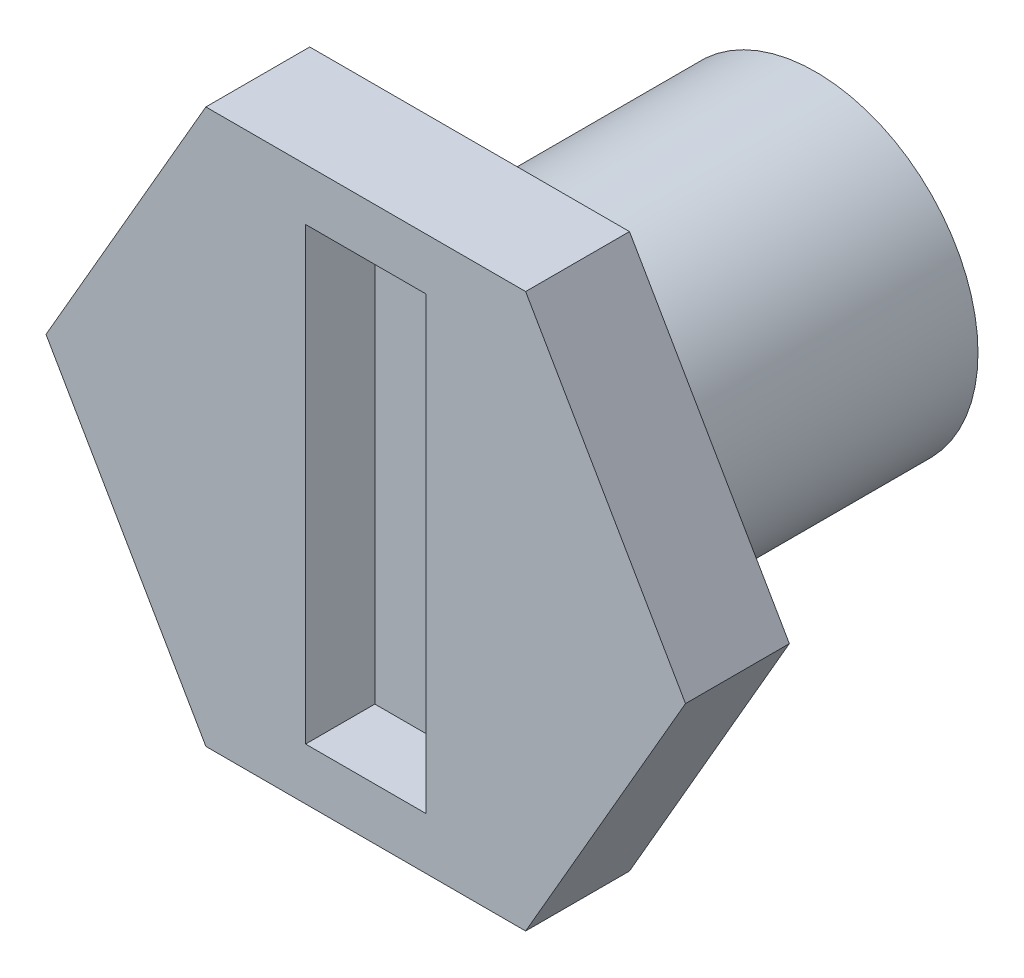
ISO-10303-21;
HEADER;
FILE_DESCRIPTION(('STEP AP214'),'2;1');
FILE_NAME('part.step','',(''),(''),'','','');
FILE_SCHEMA(('AUTOMOTIVE_DESIGN { 1 0 10303 214 1 1 1 1 }'));
ENDSEC;
DATA;
#1=APPLICATION_CONTEXT('core data for automotive mechanical design processes');
#2=APPLICATION_PROTOCOL_DEFINITION('international standard','automotive_design',2000,#1);
#3=PRODUCT_CONTEXT('',#1,'mechanical');
#4=PRODUCT('Part','Part','',(#3));
#5=PRODUCT_RELATED_PRODUCT_CATEGORY('part','',(#4));
#6=PRODUCT_DEFINITION_FORMATION('','',#4);
#7=PRODUCT_DEFINITION_CONTEXT('part definition',#1,'design');
#8=PRODUCT_DEFINITION('design','',#6,#7);
#9=PRODUCT_DEFINITION_SHAPE('','',#8);
#10=(LENGTH_UNIT() NAMED_UNIT(*) SI_UNIT(.MILLI.,.METRE.));
#11=(NAMED_UNIT(*) PLANE_ANGLE_UNIT() SI_UNIT($,.RADIAN.));
#12=(NAMED_UNIT(*) SI_UNIT($,.STERADIAN.) SOLID_ANGLE_UNIT());
#13=UNCERTAINTY_MEASURE_WITH_UNIT(LENGTH_MEASURE(1.E-05),#10,'distance_accuracy_value','');
#14=(GEOMETRIC_REPRESENTATION_CONTEXT(3) GLOBAL_UNCERTAINTY_ASSIGNED_CONTEXT((#13)) GLOBAL_UNIT_ASSIGNED_CONTEXT((#10,
#11,#12)) REPRESENTATION_CONTEXT('',''));
#15=CARTESIAN_POINT('',(0.,0.,0.));
#16=DIRECTION('',(0.,0.,1.));
#17=DIRECTION('',(1.,0.,0.));
#18=AXIS2_PLACEMENT_3D('',#15,#16,#17);
#19=CARTESIAN_POINT('',(0.,0.,100.));
#20=DIRECTION('',(0.,0.,-1.));
#21=DIRECTION('',(-1.,0.,0.));
#22=AXIS2_PLACEMENT_3D('',#19,#20,#21);
#23=CYLINDRICAL_SURFACE('',#22,46.875);
#24=CARTESIAN_POINT('',(0.,0.,100.));
#25=DIRECTION('',(0.,0.,1.));
#26=DIRECTION('',(1.,0.,0.));
#27=AXIS2_PLACEMENT_3D('',#24,#25,#26);
#28=CIRCLE('',#27,46.875);
#29=CARTESIAN_POINT('',(46.875,0.,100.));
#30=VERTEX_POINT('',#29);
#31=EDGE_CURVE('E11',#30,#30,#28,.T.);
#32=ORIENTED_EDGE('',*,*,#31,.F.);
#33=EDGE_LOOP('',(#32));
#34=FACE_BOUND('',#33,.T.);
#35=CARTESIAN_POINT('',(0.,0.,0.));
#36=DIRECTION('',(0.,0.,1.));
#37=DIRECTION('',(1.,0.,0.));
#38=AXIS2_PLACEMENT_3D('',#35,#36,#37);
#39=CIRCLE('',#38,46.875);
#40=CARTESIAN_POINT('',(46.875,0.,0.));
#41=VERTEX_POINT('',#40);
#42=EDGE_CURVE('E38',#41,#41,#39,.T.);
#43=ORIENTED_EDGE('',*,*,#42,.T.);
#44=EDGE_LOOP('',(#43));
#45=FACE_BOUND('',#44,.T.);
#46=ADVANCED_FACE('F35',(#34,#45),#23,.T.);
#47=CARTESIAN_POINT('',(0.,0.,0.));
#48=DIRECTION('',(0.,0.,1.));
#49=DIRECTION('',(1.,0.,0.));
#50=AXIS2_PLACEMENT_3D('',#47,#48,#49);
#51=PLANE('',#50);
#52=ORIENTED_EDGE('',*,*,#42,.F.);
#53=EDGE_LOOP('',(#52));
#54=FACE_BOUND('',#53,.T.);
#55=ADVANCED_FACE('F157',(#54),#51,.F.);
#56=CARTESIAN_POINT('',(0.,0.,100.));
#57=DIRECTION('',(0.,0.,1.));
#58=DIRECTION('',(1.,0.,0.));
#59=AXIS2_PLACEMENT_3D('',#56,#57,#58);
#60=PLANE('',#59);
#61=DIRECTION('',(0.5,0.866025403784439,0.));
#62=VECTOR('',#61,1.);
#63=CARTESIAN_POINT('',(46.1880215351701,-80.,100.));
#64=LINE('',#63,#62);
#65=CARTESIAN_POINT('',(46.1880215351701,-80.,100.));
#66=VERTEX_POINT('',#65);
#67=CARTESIAN_POINT('',(92.3760430703401,0.,100.));
#68=VERTEX_POINT('',#67);
#69=EDGE_CURVE('E132',#66,#68,#64,.T.);
#70=ORIENTED_EDGE('',*,*,#69,.F.);
#71=DIRECTION('',(1.,0.,0.));
#72=VECTOR('',#71,1.);
#73=CARTESIAN_POINT('',(-46.18802153517,-80.,100.));
#74=LINE('',#73,#72);
#75=CARTESIAN_POINT('',(-46.18802153517,-80.,100.));
#76=VERTEX_POINT('',#75);
#77=EDGE_CURVE('E85',#76,#66,#74,.T.);
#78=ORIENTED_EDGE('',*,*,#77,.F.);
#79=DIRECTION('',(0.5,-0.866025403784438,0.));
#80=VECTOR('',#79,1.);
#81=CARTESIAN_POINT('',(-92.3760430703401,0.,100.));
#82=LINE('',#81,#80);
#83=CARTESIAN_POINT('',(-92.3760430703401,0.,100.));
#84=VERTEX_POINT('',#83);
#85=EDGE_CURVE('E141',#84,#76,#82,.T.);
#86=ORIENTED_EDGE('',*,*,#85,.F.);
#87=DIRECTION('',(-0.5,-0.866025403784439,0.));
#88=VECTOR('',#87,1.);
#89=CARTESIAN_POINT('',(-46.1880215351701,80.,100.));
#90=LINE('',#89,#88);
#91=CARTESIAN_POINT('',(-46.1880215351701,80.,100.));
#92=VERTEX_POINT('',#91);
#93=EDGE_CURVE('E120',#92,#84,#90,.T.);
#94=ORIENTED_EDGE('',*,*,#93,.F.);
#95=DIRECTION('',(-1.,0.,0.));
#96=VECTOR('',#95,1.);
#97=CARTESIAN_POINT('',(46.18802153517,80.,100.));
#98=LINE('',#97,#96);
#99=CARTESIAN_POINT('',(46.18802153517,80.,100.));
#100=VERTEX_POINT('',#99);
#101=EDGE_CURVE('E138',#100,#92,#98,.T.);
#102=ORIENTED_EDGE('',*,*,#101,.F.);
#103=DIRECTION('',(-0.5,0.866025403784438,0.));
#104=VECTOR('',#103,1.);
#105=CARTESIAN_POINT('',(92.3760430703401,0.,100.));
#106=LINE('',#105,#104);
#107=EDGE_CURVE('E135',#68,#100,#106,.T.);
#108=ORIENTED_EDGE('',*,*,#107,.F.);
#109=EDGE_LOOP('',(#70,#78,#86,#94,#102,#108));
#110=FACE_BOUND('',#109,.T.);
#111=ORIENTED_EDGE('',*,*,#31,.T.);
#112=EDGE_LOOP('',(#111));
#113=FACE_BOUND('',#112,.T.);
#114=ADVANCED_FACE('F159',(#110,#113),#60,.F.);
#115=CARTESIAN_POINT('',(46.1880215351701,-80.,130.));
#116=DIRECTION('',(-0.866025403784439,0.5,0.));
#117=DIRECTION('',(-0.5,-0.866025403784439,0.));
#118=AXIS2_PLACEMENT_3D('',#115,#116,#117);
#119=PLANE('',#118);
#120=ORIENTED_EDGE('',*,*,#69,.T.);
#121=DIRECTION('',(0.,0.,-1.));
#122=VECTOR('',#121,1.);
#123=CARTESIAN_POINT('',(92.3760430703401,0.,130.));
#124=LINE('',#123,#122);
#125=CARTESIAN_POINT('',(92.3760430703401,0.,130.));
#126=VERTEX_POINT('',#125);
#127=EDGE_CURVE('E151',#126,#68,#124,.T.);
#128=ORIENTED_EDGE('',*,*,#127,.F.);
#129=DIRECTION('',(0.5,0.866025403784439,0.));
#130=VECTOR('',#129,1.);
#131=CARTESIAN_POINT('',(46.1880215351701,-80.,130.));
#132=LINE('',#131,#130);
#133=CARTESIAN_POINT('',(46.1880215351701,-80.,130.));
#134=VERTEX_POINT('',#133);
#135=EDGE_CURVE('E144',#134,#126,#132,.T.);
#136=ORIENTED_EDGE('',*,*,#135,.F.);
#137=DIRECTION('',(0.,0.,-1.));
#138=VECTOR('',#137,1.);
#139=CARTESIAN_POINT('',(46.1880215351701,-80.,130.));
#140=LINE('',#139,#138);
#141=EDGE_CURVE('E128',#134,#66,#140,.T.);
#142=ORIENTED_EDGE('',*,*,#141,.T.);
#143=EDGE_LOOP('',(#120,#128,#136,#142));
#144=FACE_BOUND('',#143,.T.);
#145=ADVANCED_FACE('F164',(#144),#119,.F.);
#146=CARTESIAN_POINT('',(92.3760430703401,0.,130.));
#147=DIRECTION('',(-0.866025403784438,-0.5,0.));
#148=DIRECTION('',(0.5,-0.866025403784438,0.));
#149=AXIS2_PLACEMENT_3D('',#146,#147,#148);
#150=PLANE('',#149);
#151=ORIENTED_EDGE('',*,*,#107,.T.);
#152=DIRECTION('',(0.,0.,-1.));
#153=VECTOR('',#152,1.);
#154=CARTESIAN_POINT('',(46.18802153517,80.,130.));
#155=LINE('',#154,#153);
#156=CARTESIAN_POINT('',(46.18802153517,80.,130.));
#157=VERTEX_POINT('',#156);
#158=EDGE_CURVE('E148',#157,#100,#155,.T.);
#159=ORIENTED_EDGE('',*,*,#158,.F.);
#160=DIRECTION('',(-0.5,0.866025403784438,0.));
#161=VECTOR('',#160,1.);
#162=CARTESIAN_POINT('',(92.3760430703401,0.,130.));
#163=LINE('',#162,#161);
#164=EDGE_CURVE('E94',#126,#157,#163,.T.);
#165=ORIENTED_EDGE('',*,*,#164,.F.);
#166=ORIENTED_EDGE('',*,*,#127,.T.);
#167=EDGE_LOOP('',(#151,#159,#165,#166));
#168=FACE_BOUND('',#167,.T.);
#169=ADVANCED_FACE('F171',(#168),#150,.F.);
#170=CARTESIAN_POINT('',(46.18802153517,80.,130.));
#171=DIRECTION('',(0.,-1.,0.));
#172=DIRECTION('',(0.,0.,-1.));
#173=AXIS2_PLACEMENT_3D('',#170,#171,#172);
#174=PLANE('',#173);
#175=ORIENTED_EDGE('',*,*,#101,.T.);
#176=DIRECTION('',(0.,0.,-1.));
#177=VECTOR('',#176,1.);
#178=CARTESIAN_POINT('',(-46.1880215351701,80.,130.));
#179=LINE('',#178,#177);
#180=CARTESIAN_POINT('',(-46.1880215351701,80.,130.));
#181=VERTEX_POINT('',#180);
#182=EDGE_CURVE('E123',#181,#92,#179,.T.);
#183=ORIENTED_EDGE('',*,*,#182,.F.);
#184=DIRECTION('',(-1.,0.,0.));
#185=VECTOR('',#184,1.);
#186=CARTESIAN_POINT('',(46.18802153517,80.,130.));
#187=LINE('',#186,#185);
#188=EDGE_CURVE('E111',#157,#181,#187,.T.);
#189=ORIENTED_EDGE('',*,*,#188,.F.);
#190=ORIENTED_EDGE('',*,*,#158,.T.);
#191=EDGE_LOOP('',(#175,#183,#189,#190));
#192=FACE_BOUND('',#191,.T.);
#193=ADVANCED_FACE('F175',(#192),#174,.F.);
#194=CARTESIAN_POINT('',(-46.1880215351701,80.,130.));
#195=DIRECTION('',(0.866025403784439,-0.5,0.));
#196=DIRECTION('',(0.5,0.866025403784439,0.));
#197=AXIS2_PLACEMENT_3D('',#194,#195,#196);
#198=PLANE('',#197);
#199=ORIENTED_EDGE('',*,*,#93,.T.);
#200=DIRECTION('',(0.,0.,-1.));
#201=VECTOR('',#200,1.);
#202=CARTESIAN_POINT('',(-92.3760430703401,0.,130.));
#203=LINE('',#202,#201);
#204=CARTESIAN_POINT('',(-92.3760430703401,0.,130.));
#205=VERTEX_POINT('',#204);
#206=EDGE_CURVE('E117',#205,#84,#203,.T.);
#207=ORIENTED_EDGE('',*,*,#206,.F.);
#208=DIRECTION('',(-0.5,-0.866025403784439,0.));
#209=VECTOR('',#208,1.);
#210=CARTESIAN_POINT('',(-46.1880215351701,80.,130.));
#211=LINE('',#210,#209);
#212=EDGE_CURVE('E104',#181,#205,#211,.T.);
#213=ORIENTED_EDGE('',*,*,#212,.F.);
#214=ORIENTED_EDGE('',*,*,#182,.T.);
#215=EDGE_LOOP('',(#199,#207,#213,#214));
#216=FACE_BOUND('',#215,.T.);
#217=ADVANCED_FACE('F118',(#216),#198,.F.);
#218=CARTESIAN_POINT('',(-92.3760430703401,0.,130.));
#219=DIRECTION('',(0.866025403784438,0.5,0.));
#220=DIRECTION('',(-0.5,0.866025403784438,0.));
#221=AXIS2_PLACEMENT_3D('',#218,#219,#220);
#222=PLANE('',#221);
#223=ORIENTED_EDGE('',*,*,#85,.T.);
#224=DIRECTION('',(0.,0.,-1.));
#225=VECTOR('',#224,1.);
#226=CARTESIAN_POINT('',(-46.18802153517,-80.,130.));
#227=LINE('',#226,#225);
#228=CARTESIAN_POINT('',(-46.18802153517,-80.,130.));
#229=VERTEX_POINT('',#228);
#230=EDGE_CURVE('E124',#229,#76,#227,.T.);
#231=ORIENTED_EDGE('',*,*,#230,.F.);
#232=DIRECTION('',(0.5,-0.866025403784438,0.));
#233=VECTOR('',#232,1.);
#234=CARTESIAN_POINT('',(-92.3760430703401,0.,130.));
#235=LINE('',#234,#233);
#236=EDGE_CURVE('E108',#205,#229,#235,.T.);
#237=ORIENTED_EDGE('',*,*,#236,.F.);
#238=ORIENTED_EDGE('',*,*,#206,.T.);
#239=EDGE_LOOP('',(#223,#231,#237,#238));
#240=FACE_BOUND('',#239,.T.);
#241=ADVANCED_FACE('F126',(#240),#222,.F.);
#242=CARTESIAN_POINT('',(-46.18802153517,-80.,130.));
#243=DIRECTION('',(0.,1.,0.));
#244=DIRECTION('',(-1.,0.,0.));
#245=AXIS2_PLACEMENT_3D('',#242,#243,#244);
#246=PLANE('',#245);
#247=ORIENTED_EDGE('',*,*,#77,.T.);
#248=ORIENTED_EDGE('',*,*,#141,.F.);
#249=DIRECTION('',(1.,0.,0.));
#250=VECTOR('',#249,1.);
#251=CARTESIAN_POINT('',(-46.18802153517,-80.,130.));
#252=LINE('',#251,#250);
#253=EDGE_CURVE('E58',#229,#134,#252,.T.);
#254=ORIENTED_EDGE('',*,*,#253,.F.);
#255=ORIENTED_EDGE('',*,*,#230,.T.);
#256=EDGE_LOOP('',(#247,#248,#254,#255));
#257=FACE_BOUND('',#256,.T.);
#258=ADVANCED_FACE('F183',(#257),#246,.F.);
#259=CARTESIAN_POINT('',(0.,0.,130.));
#260=DIRECTION('',(0.,0.,1.));
#261=DIRECTION('',(1.,0.,0.));
#262=AXIS2_PLACEMENT_3D('',#259,#260,#261);
#263=PLANE('',#262);
#264=DIRECTION('',(0.,-1.,0.));
#265=VECTOR('',#264,1.);
#266=CARTESIAN_POINT('',(-17.3760430703401,65.,130.));
#267=LINE('',#266,#265);
#268=CARTESIAN_POINT('',(-17.3760430703401,65.,130.));
#269=VERTEX_POINT('',#268);
#270=CARTESIAN_POINT('',(-17.3760430703401,-65.,130.));
#271=VERTEX_POINT('',#270);
#272=EDGE_CURVE('E49',#269,#271,#267,.T.);
#273=ORIENTED_EDGE('',*,*,#272,.F.);
#274=DIRECTION('',(-1.,0.,0.));
#275=VECTOR('',#274,1.);
#276=CARTESIAN_POINT('',(-17.3760430703401,65.,130.));
#277=LINE('',#276,#275);
#278=CARTESIAN_POINT('',(17.3760430703401,65.,130.));
#279=VERTEX_POINT('',#278);
#280=EDGE_CURVE('E222',#279,#269,#277,.T.);
#281=ORIENTED_EDGE('',*,*,#280,.F.);
#282=DIRECTION('',(0.,1.,0.));
#283=VECTOR('',#282,1.);
#284=CARTESIAN_POINT('',(17.3760430703401,65.,130.));
#285=LINE('',#284,#283);
#286=CARTESIAN_POINT('',(17.3760430703402,-65.,130.));
#287=VERTEX_POINT('',#286);
#288=EDGE_CURVE('E227',#287,#279,#285,.T.);
#289=ORIENTED_EDGE('',*,*,#288,.F.);
#290=DIRECTION('',(1.,0.,0.));
#291=VECTOR('',#290,1.);
#292=CARTESIAN_POINT('',(-17.3760430703401,-65.,130.));
#293=LINE('',#292,#291);
#294=EDGE_CURVE('E234',#271,#287,#293,.T.);
#295=ORIENTED_EDGE('',*,*,#294,.F.);
#296=EDGE_LOOP('',(#273,#281,#289,#295));
#297=FACE_BOUND('',#296,.T.);
#298=ORIENTED_EDGE('',*,*,#135,.T.);
#299=ORIENTED_EDGE('',*,*,#164,.T.);
#300=ORIENTED_EDGE('',*,*,#188,.T.);
#301=ORIENTED_EDGE('',*,*,#212,.T.);
#302=ORIENTED_EDGE('',*,*,#236,.T.);
#303=ORIENTED_EDGE('',*,*,#253,.T.);
#304=EDGE_LOOP('',(#298,#299,#300,#301,#302,#303));
#305=FACE_BOUND('',#304,.T.);
#306=ADVANCED_FACE('F106',(#297,#305),#263,.T.);
#307=CARTESIAN_POINT('',(-17.3760430703401,65.,110.));
#308=DIRECTION('',(-1.,0.,0.));
#309=DIRECTION('',(0.,-1.,0.));
#310=AXIS2_PLACEMENT_3D('',#307,#308,#309);
#311=PLANE('',#310);
#312=ORIENTED_EDGE('',*,*,#272,.T.);
#313=DIRECTION('',(0.,0.,1.));
#314=VECTOR('',#313,1.);
#315=CARTESIAN_POINT('',(-17.3760430703401,-65.,110.));
#316=LINE('',#315,#314);
#317=CARTESIAN_POINT('',(-17.3760430703401,-65.,110.));
#318=VERTEX_POINT('',#317);
#319=EDGE_CURVE('E232',#318,#271,#316,.T.);
#320=ORIENTED_EDGE('',*,*,#319,.F.);
#321=DIRECTION('',(0.,-1.,0.));
#322=VECTOR('',#321,1.);
#323=CARTESIAN_POINT('',(-17.3760430703401,65.,110.));
#324=LINE('',#323,#322);
#325=CARTESIAN_POINT('',(-17.3760430703401,65.,110.));
#326=VERTEX_POINT('',#325);
#327=EDGE_CURVE('E214',#326,#318,#324,.T.);
#328=ORIENTED_EDGE('',*,*,#327,.F.);
#329=DIRECTION('',(0.,0.,1.));
#330=VECTOR('',#329,1.);
#331=CARTESIAN_POINT('',(-17.3760430703401,65.,110.));
#332=LINE('',#331,#330);
#333=EDGE_CURVE('E136',#326,#269,#332,.T.);
#334=ORIENTED_EDGE('',*,*,#333,.T.);
#335=EDGE_LOOP('',(#312,#320,#328,#334));
#336=FACE_BOUND('',#335,.T.);
#337=ADVANCED_FACE('F188',(#336),#311,.F.);
#338=CARTESIAN_POINT('',(-17.3760430703401,65.,110.));
#339=DIRECTION('',(0.,1.,0.));
#340=DIRECTION('',(0.,0.,1.));
#341=AXIS2_PLACEMENT_3D('',#338,#339,#340);
#342=PLANE('',#341);
#343=ORIENTED_EDGE('',*,*,#280,.T.);
#344=ORIENTED_EDGE('',*,*,#333,.F.);
#345=DIRECTION('',(-1.,0.,0.));
#346=VECTOR('',#345,1.);
#347=CARTESIAN_POINT('',(-17.3760430703401,65.,110.));
#348=LINE('',#347,#346);
#349=CARTESIAN_POINT('',(17.3760430703401,65.,110.));
#350=VERTEX_POINT('',#349);
#351=EDGE_CURVE('E220',#350,#326,#348,.T.);
#352=ORIENTED_EDGE('',*,*,#351,.F.);
#353=DIRECTION('',(0.,0.,1.));
#354=VECTOR('',#353,1.);
#355=CARTESIAN_POINT('',(17.3760430703401,65.,110.));
#356=LINE('',#355,#354);
#357=EDGE_CURVE('E240',#350,#279,#356,.T.);
#358=ORIENTED_EDGE('',*,*,#357,.T.);
#359=EDGE_LOOP('',(#343,#344,#352,#358));
#360=FACE_BOUND('',#359,.T.);
#361=ADVANCED_FACE('F192',(#360),#342,.F.);
#362=CARTESIAN_POINT('',(17.3760430703401,65.,110.));
#363=DIRECTION('',(1.,0.,0.));
#364=DIRECTION('',(0.,1.,0.));
#365=AXIS2_PLACEMENT_3D('',#362,#363,#364);
#366=PLANE('',#365);
#367=ORIENTED_EDGE('',*,*,#288,.T.);
#368=ORIENTED_EDGE('',*,*,#357,.F.);
#369=DIRECTION('',(0.,1.,0.));
#370=VECTOR('',#369,1.);
#371=CARTESIAN_POINT('',(17.3760430703401,65.,110.));
#372=LINE('',#371,#370);
#373=CARTESIAN_POINT('',(17.3760430703402,-65.,110.));
#374=VERTEX_POINT('',#373);
#375=EDGE_CURVE('E224',#374,#350,#372,.T.);
#376=ORIENTED_EDGE('',*,*,#375,.F.);
#377=DIRECTION('',(0.,0.,1.));
#378=VECTOR('',#377,1.);
#379=CARTESIAN_POINT('',(17.3760430703402,-65.,110.));
#380=LINE('',#379,#378);
#381=EDGE_CURVE('E243',#374,#287,#380,.T.);
#382=ORIENTED_EDGE('',*,*,#381,.T.);
#383=EDGE_LOOP('',(#367,#368,#376,#382));
#384=FACE_BOUND('',#383,.T.);
#385=ADVANCED_FACE('F197',(#384),#366,.F.);
#386=CARTESIAN_POINT('',(-17.3760430703401,-65.,110.));
#387=DIRECTION('',(0.,-1.,0.));
#388=DIRECTION('',(0.,0.,-1.));
#389=AXIS2_PLACEMENT_3D('',#386,#387,#388);
#390=PLANE('',#389);
#391=ORIENTED_EDGE('',*,*,#294,.T.);
#392=ORIENTED_EDGE('',*,*,#381,.F.);
#393=DIRECTION('',(1.,0.,0.));
#394=VECTOR('',#393,1.);
#395=CARTESIAN_POINT('',(-17.3760430703401,-65.,110.));
#396=LINE('',#395,#394);
#397=EDGE_CURVE('E218',#318,#374,#396,.T.);
#398=ORIENTED_EDGE('',*,*,#397,.F.);
#399=ORIENTED_EDGE('',*,*,#319,.T.);
#400=EDGE_LOOP('',(#391,#392,#398,#399));
#401=FACE_BOUND('',#400,.T.);
#402=ADVANCED_FACE('F193',(#401),#390,.F.);
#403=CARTESIAN_POINT('',(0.,0.,110.));
#404=DIRECTION('',(0.,0.,1.));
#405=DIRECTION('',(1.,0.,0.));
#406=AXIS2_PLACEMENT_3D('',#403,#404,#405);
#407=PLANE('',#406);
#408=ORIENTED_EDGE('',*,*,#327,.T.);
#409=ORIENTED_EDGE('',*,*,#397,.T.);
#410=ORIENTED_EDGE('',*,*,#375,.T.);
#411=ORIENTED_EDGE('',*,*,#351,.T.);
#412=EDGE_LOOP('',(#408,#409,#410,#411));
#413=FACE_BOUND('',#412,.T.);
#414=ADVANCED_FACE('F196',(#413),#407,.T.);
#415=CLOSED_SHELL('',(#46,#55,#114,#145,#169,#193,#217,#241,#258,#306,#337,#361,#385,#402,#414));
#416=MANIFOLD_SOLID_BREP('B2',#415);
#417=ADVANCED_BREP_SHAPE_REPRESENTATION('',(#18,#416),#14);
#418=SHAPE_DEFINITION_REPRESENTATION(#9,#417);
ENDSEC;
END-ISO-10303-21;
